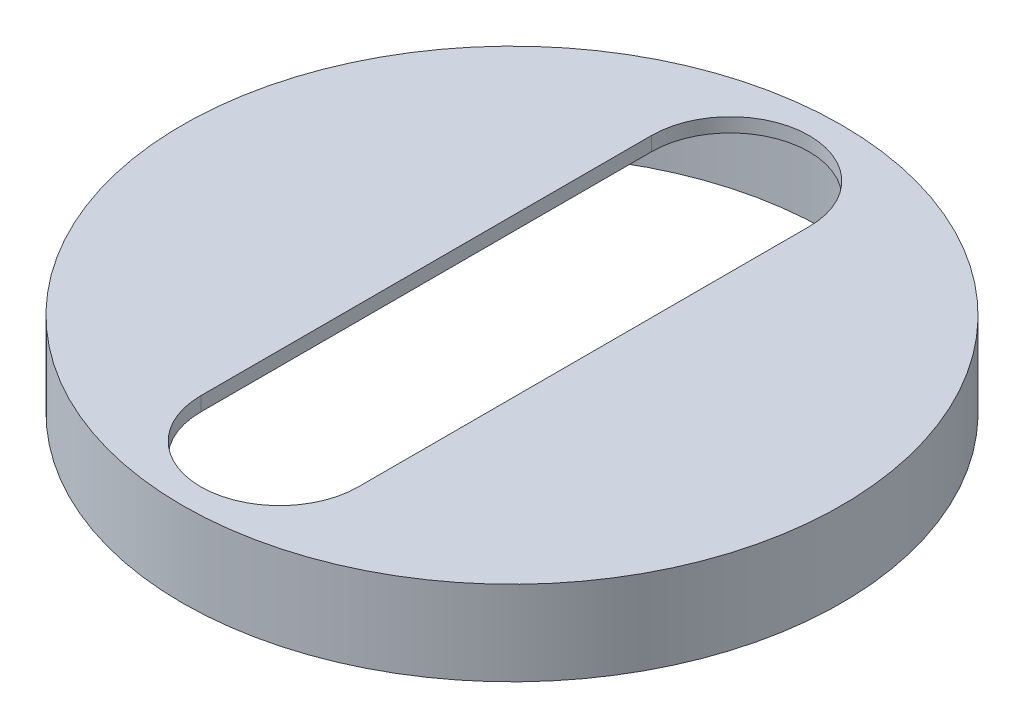
ISO-10303-21;
HEADER;
FILE_DESCRIPTION(('STEP AP214'),'2;1');
FILE_NAME('part.step','',(''),(''),'','','');
FILE_SCHEMA(('AUTOMOTIVE_DESIGN { 1 0 10303 214 1 1 1 1 }'));
ENDSEC;
DATA;
#1=APPLICATION_CONTEXT('core data for automotive mechanical design processes');
#2=APPLICATION_PROTOCOL_DEFINITION('international standard','automotive_design',2000,#1);
#3=PRODUCT_CONTEXT('',#1,'mechanical');
#4=PRODUCT('Part','Part','',(#3));
#5=PRODUCT_RELATED_PRODUCT_CATEGORY('part','',(#4));
#6=PRODUCT_DEFINITION_FORMATION('','',#4);
#7=PRODUCT_DEFINITION_CONTEXT('part definition',#1,'design');
#8=PRODUCT_DEFINITION('design','',#6,#7);
#9=PRODUCT_DEFINITION_SHAPE('','',#8);
#10=(LENGTH_UNIT() NAMED_UNIT(*) SI_UNIT(.MILLI.,.METRE.));
#11=(NAMED_UNIT(*) PLANE_ANGLE_UNIT() SI_UNIT($,.RADIAN.));
#12=(NAMED_UNIT(*) SI_UNIT($,.STERADIAN.) SOLID_ANGLE_UNIT());
#13=UNCERTAINTY_MEASURE_WITH_UNIT(LENGTH_MEASURE(1.E-05),#10,'distance_accuracy_value','');
#14=(GEOMETRIC_REPRESENTATION_CONTEXT(3) GLOBAL_UNCERTAINTY_ASSIGNED_CONTEXT((#13)) GLOBAL_UNIT_ASSIGNED_CONTEXT((#10,
#11,#12)) REPRESENTATION_CONTEXT('',''));
#15=CARTESIAN_POINT('',(0.,0.,0.));
#16=DIRECTION('',(0.,0.,1.));
#17=DIRECTION('',(1.,0.,0.));
#18=AXIS2_PLACEMENT_3D('',#15,#16,#17);
#19=CARTESIAN_POINT('',(0.,-60.,0.));
#20=DIRECTION('',(0.,1.,0.));
#21=DIRECTION('',(0.,0.,1.));
#22=AXIS2_PLACEMENT_3D('',#19,#20,#21);
#23=CYLINDRICAL_SURFACE('',#22,224.);
#24=CARTESIAN_POINT('',(0.,-60.,0.));
#25=DIRECTION('',(0.,1.,0.));
#26=DIRECTION('',(0.,0.,1.));
#27=AXIS2_PLACEMENT_3D('',#24,#25,#26);
#28=CIRCLE('',#27,224.);
#29=CARTESIAN_POINT('',(0.,-60.,224.));
#30=VERTEX_POINT('',#29);
#31=EDGE_CURVE('E115',#30,#30,#28,.T.);
#32=ORIENTED_EDGE('',*,*,#31,.F.);
#33=EDGE_LOOP('',(#32));
#34=FACE_BOUND('',#33,.T.);
#35=CARTESIAN_POINT('',(0.,-10.,0.));
#36=DIRECTION('',(0.,1.,0.));
#37=DIRECTION('',(0.,0.,1.));
#38=AXIS2_PLACEMENT_3D('',#35,#36,#37);
#39=CIRCLE('',#38,224.);
#40=CARTESIAN_POINT('',(0.,-10.,224.));
#41=VERTEX_POINT('',#40);
#42=EDGE_CURVE('E11',#41,#41,#39,.F.);
#43=ORIENTED_EDGE('',*,*,#42,.F.);
#44=EDGE_LOOP('',(#43));
#45=FACE_BOUND('',#44,.T.);
#46=ADVANCED_FACE('F37',(#34,#45),#23,.F.);
#47=CARTESIAN_POINT('',(0.,-60.,0.));
#48=DIRECTION('',(0.,1.,0.));
#49=DIRECTION('',(0.,0.,1.));
#50=AXIS2_PLACEMENT_3D('',#47,#48,#49);
#51=CYLINDRICAL_SURFACE('',#50,234.);
#52=CARTESIAN_POINT('',(0.,-60.,0.));
#53=DIRECTION('',(0.,1.,0.));
#54=DIRECTION('',(0.,0.,1.));
#55=AXIS2_PLACEMENT_3D('',#52,#53,#54);
#56=CIRCLE('',#55,234.);
#57=CARTESIAN_POINT('',(0.,-60.,234.));
#58=VERTEX_POINT('',#57);
#59=EDGE_CURVE('E45',#58,#58,#56,.T.);
#60=ORIENTED_EDGE('',*,*,#59,.T.);
#61=EDGE_LOOP('',(#60));
#62=FACE_BOUND('',#61,.T.);
#63=CARTESIAN_POINT('',(0.,0.,0.));
#64=DIRECTION('',(0.,1.,0.));
#65=DIRECTION('',(0.,0.,1.));
#66=AXIS2_PLACEMENT_3D('',#63,#64,#65);
#67=CIRCLE('',#66,234.);
#68=CARTESIAN_POINT('',(0.,0.,234.));
#69=VERTEX_POINT('',#68);
#70=EDGE_CURVE('E112',#69,#69,#67,.T.);
#71=ORIENTED_EDGE('',*,*,#70,.F.);
#72=EDGE_LOOP('',(#71));
#73=FACE_BOUND('',#72,.T.);
#74=ADVANCED_FACE('F125',(#62,#73),#51,.T.);
#75=CARTESIAN_POINT('',(0.,-60.,0.));
#76=DIRECTION('',(0.,1.,0.));
#77=DIRECTION('',(0.,0.,1.));
#78=AXIS2_PLACEMENT_3D('',#75,#76,#77);
#79=PLANE('',#78);
#80=ORIENTED_EDGE('',*,*,#31,.T.);
#81=EDGE_LOOP('',(#80));
#82=FACE_BOUND('',#81,.T.);
#83=ORIENTED_EDGE('',*,*,#59,.F.);
#84=EDGE_LOOP('',(#83));
#85=FACE_BOUND('',#84,.T.);
#86=ADVANCED_FACE('F127',(#82,#85),#79,.F.);
#87=CARTESIAN_POINT('',(0.,0.,0.));
#88=DIRECTION('',(0.,1.,0.));
#89=DIRECTION('',(0.,0.,1.));
#90=AXIS2_PLACEMENT_3D('',#87,#88,#89);
#91=PLANE('',#90);
#92=ORIENTED_EDGE('',*,*,#70,.T.);
#93=EDGE_LOOP('',(#92));
#94=FACE_BOUND('',#93,.T.);
#95=CARTESIAN_POINT('',(-5.,0.,-160.));
#96=DIRECTION('',(0.,1.,0.));
#97=DIRECTION('',(0.,0.,1.));
#98=AXIS2_PLACEMENT_3D('',#95,#96,#97);
#99=CIRCLE('',#98,56.);
#100=CARTESIAN_POINT('',(51.,0.,-160.));
#101=VERTEX_POINT('',#100);
#102=CARTESIAN_POINT('',(-61.,0.,-160.));
#103=VERTEX_POINT('',#102);
#104=EDGE_CURVE('E104',#101,#103,#99,.T.);
#105=ORIENTED_EDGE('',*,*,#104,.F.);
#106=DIRECTION('',(0.,0.,1.));
#107=VECTOR('',#106,1.);
#108=CARTESIAN_POINT('',(51.,0.,0.));
#109=LINE('',#108,#107);
#110=CARTESIAN_POINT('',(51.,0.,160.));
#111=VERTEX_POINT('',#110);
#112=EDGE_CURVE('E106',#101,#111,#109,.T.);
#113=ORIENTED_EDGE('',*,*,#112,.T.);
#114=CARTESIAN_POINT('',(-4.99999999999998,0.,160.));
#115=DIRECTION('',(0.,1.,0.));
#116=DIRECTION('',(0.,0.,1.));
#117=AXIS2_PLACEMENT_3D('',#114,#115,#116);
#118=CIRCLE('',#117,56.);
#119=CARTESIAN_POINT('',(-61.,0.,160.));
#120=VERTEX_POINT('',#119);
#121=EDGE_CURVE('E95',#120,#111,#118,.T.);
#122=ORIENTED_EDGE('',*,*,#121,.F.);
#123=DIRECTION('',(0.,0.,-1.));
#124=VECTOR('',#123,1.);
#125=CARTESIAN_POINT('',(-61.,0.,0.));
#126=LINE('',#125,#124);
#127=EDGE_CURVE('E100',#120,#103,#126,.T.);
#128=ORIENTED_EDGE('',*,*,#127,.T.);
#129=EDGE_LOOP('',(#105,#113,#122,#128));
#130=FACE_BOUND('',#129,.T.);
#131=ADVANCED_FACE('F122',(#94,#130),#91,.T.);
#132=CARTESIAN_POINT('',(-5.,-10.,-160.));
#133=DIRECTION('',(0.,1.,0.));
#134=DIRECTION('',(0.,0.,1.));
#135=AXIS2_PLACEMENT_3D('',#132,#133,#134);
#136=CYLINDRICAL_SURFACE('',#135,56.);
#137=ORIENTED_EDGE('',*,*,#104,.T.);
#138=DIRECTION('',(0.,1.,0.));
#139=VECTOR('',#138,1.);
#140=CARTESIAN_POINT('',(-61.,-10.,-160.));
#141=LINE('',#140,#139);
#142=CARTESIAN_POINT('',(-61.,-10.,-160.));
#143=VERTEX_POINT('',#142);
#144=EDGE_CURVE('E77',#143,#103,#141,.T.);
#145=ORIENTED_EDGE('',*,*,#144,.F.);
#146=CARTESIAN_POINT('',(-5.,-10.,-160.));
#147=DIRECTION('',(0.,1.,0.));
#148=DIRECTION('',(0.,0.,1.));
#149=AXIS2_PLACEMENT_3D('',#146,#147,#148);
#150=CIRCLE('',#149,56.);
#151=CARTESIAN_POINT('',(51.,-10.,-160.));
#152=VERTEX_POINT('',#151);
#153=EDGE_CURVE('E53',#152,#143,#150,.T.);
#154=ORIENTED_EDGE('',*,*,#153,.F.);
#155=DIRECTION('',(0.,1.,0.));
#156=VECTOR('',#155,1.);
#157=CARTESIAN_POINT('',(51.,-10.,-160.));
#158=LINE('',#157,#156);
#159=EDGE_CURVE('E84',#152,#101,#158,.T.);
#160=ORIENTED_EDGE('',*,*,#159,.T.);
#161=EDGE_LOOP('',(#137,#145,#154,#160));
#162=FACE_BOUND('',#161,.T.);
#163=ADVANCED_FACE('F138',(#162),#136,.F.);
#164=CARTESIAN_POINT('',(-61.,-10.,0.));
#165=DIRECTION('',(1.,0.,0.));
#166=DIRECTION('',(0.,0.,-1.));
#167=AXIS2_PLACEMENT_3D('',#164,#165,#166);
#168=PLANE('',#167);
#169=ORIENTED_EDGE('',*,*,#127,.F.);
#170=DIRECTION('',(0.,1.,0.));
#171=VECTOR('',#170,1.);
#172=CARTESIAN_POINT('',(-61.,-10.,160.));
#173=LINE('',#172,#171);
#174=CARTESIAN_POINT('',(-61.,-10.,160.));
#175=VERTEX_POINT('',#174);
#176=EDGE_CURVE('E70',#175,#120,#173,.T.);
#177=ORIENTED_EDGE('',*,*,#176,.F.);
#178=DIRECTION('',(0.,0.,-1.));
#179=VECTOR('',#178,1.);
#180=CARTESIAN_POINT('',(-61.,-10.,0.));
#181=LINE('',#180,#179);
#182=EDGE_CURVE('E91',#175,#143,#181,.T.);
#183=ORIENTED_EDGE('',*,*,#182,.T.);
#184=ORIENTED_EDGE('',*,*,#144,.T.);
#185=EDGE_LOOP('',(#169,#177,#183,#184));
#186=FACE_BOUND('',#185,.T.);
#187=ADVANCED_FACE('F142',(#186),#168,.T.);
#188=CARTESIAN_POINT('',(-4.99999999999998,-10.,160.));
#189=DIRECTION('',(0.,1.,0.));
#190=DIRECTION('',(0.,0.,1.));
#191=AXIS2_PLACEMENT_3D('',#188,#189,#190);
#192=CYLINDRICAL_SURFACE('',#191,56.);
#193=ORIENTED_EDGE('',*,*,#121,.T.);
#194=DIRECTION('',(0.,1.,0.));
#195=VECTOR('',#194,1.);
#196=CARTESIAN_POINT('',(51.,-10.,160.));
#197=LINE('',#196,#195);
#198=CARTESIAN_POINT('',(51.,-10.,160.));
#199=VERTEX_POINT('',#198);
#200=EDGE_CURVE('E93',#199,#111,#197,.T.);
#201=ORIENTED_EDGE('',*,*,#200,.F.);
#202=CARTESIAN_POINT('',(-4.99999999999998,-10.,160.));
#203=DIRECTION('',(0.,1.,0.));
#204=DIRECTION('',(0.,0.,1.));
#205=AXIS2_PLACEMENT_3D('',#202,#203,#204);
#206=CIRCLE('',#205,56.);
#207=EDGE_CURVE('E86',#175,#199,#206,.T.);
#208=ORIENTED_EDGE('',*,*,#207,.F.);
#209=ORIENTED_EDGE('',*,*,#176,.T.);
#210=EDGE_LOOP('',(#193,#201,#208,#209));
#211=FACE_BOUND('',#210,.T.);
#212=ADVANCED_FACE('F94',(#211),#192,.F.);
#213=CARTESIAN_POINT('',(51.,-10.,0.));
#214=DIRECTION('',(-1.,0.,0.));
#215=DIRECTION('',(0.,0.,1.));
#216=AXIS2_PLACEMENT_3D('',#213,#214,#215);
#217=PLANE('',#216);
#218=ORIENTED_EDGE('',*,*,#112,.F.);
#219=ORIENTED_EDGE('',*,*,#159,.F.);
#220=DIRECTION('',(0.,0.,1.));
#221=VECTOR('',#220,1.);
#222=CARTESIAN_POINT('',(51.,-10.,0.));
#223=LINE('',#222,#221);
#224=EDGE_CURVE('E90',#152,#199,#223,.T.);
#225=ORIENTED_EDGE('',*,*,#224,.T.);
#226=ORIENTED_EDGE('',*,*,#200,.T.);
#227=EDGE_LOOP('',(#218,#219,#225,#226));
#228=FACE_BOUND('',#227,.T.);
#229=ADVANCED_FACE('F98',(#228),#217,.T.);
#230=CARTESIAN_POINT('',(0.,-10.,0.));
#231=DIRECTION('',(0.,1.,0.));
#232=DIRECTION('',(0.,0.,1.));
#233=AXIS2_PLACEMENT_3D('',#230,#231,#232);
#234=PLANE('',#233);
#235=ORIENTED_EDGE('',*,*,#153,.T.);
#236=ORIENTED_EDGE('',*,*,#182,.F.);
#237=ORIENTED_EDGE('',*,*,#207,.T.);
#238=ORIENTED_EDGE('',*,*,#224,.F.);
#239=EDGE_LOOP('',(#235,#236,#237,#238));
#240=FACE_BOUND('',#239,.T.);
#241=ORIENTED_EDGE('',*,*,#42,.T.);
#242=EDGE_LOOP('',(#241));
#243=FACE_BOUND('',#242,.T.);
#244=ADVANCED_FACE('F88',(#240,#243),#234,.F.);
#245=CLOSED_SHELL('',(#46,#74,#86,#131,#163,#187,#212,#229,#244));
#246=MANIFOLD_SOLID_BREP('B2',#245);
#247=ADVANCED_BREP_SHAPE_REPRESENTATION('',(#18,#246),#14);
#248=SHAPE_DEFINITION_REPRESENTATION(#9,#247);
ENDSEC;
END-ISO-10303-21;
